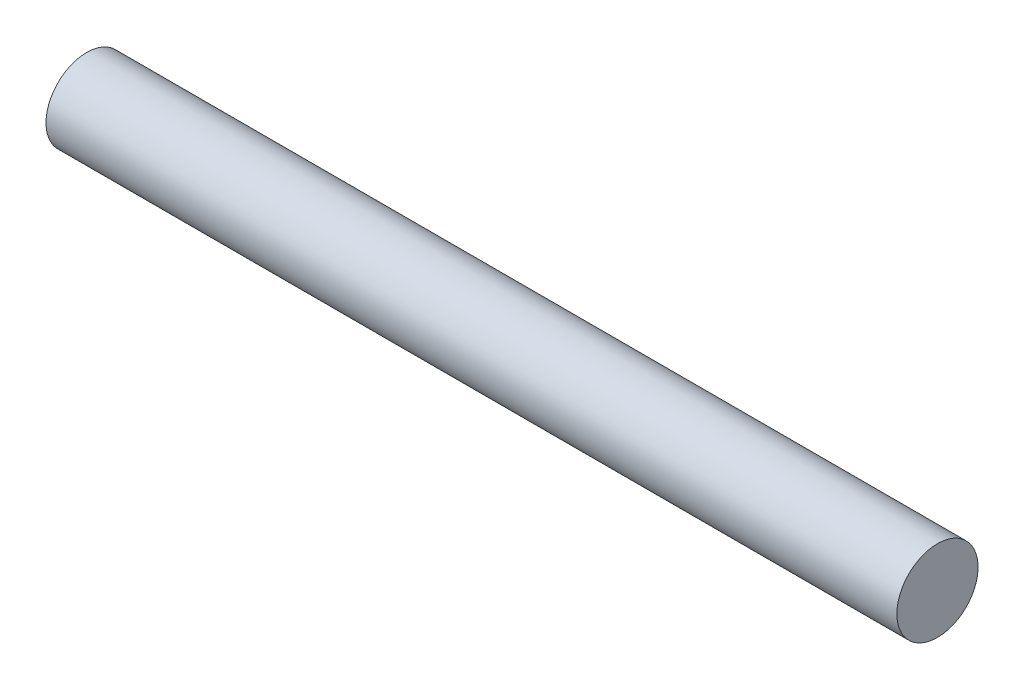
ISO-10303-21;
HEADER;
FILE_DESCRIPTION(('STEP AP214'),'2;1');
FILE_NAME('part.step','',(''),(''),'','','');
FILE_SCHEMA(('AUTOMOTIVE_DESIGN { 1 0 10303 214 1 1 1 1 }'));
ENDSEC;
DATA;
#1=APPLICATION_CONTEXT('core data for automotive mechanical design processes');
#2=APPLICATION_PROTOCOL_DEFINITION('international standard','automotive_design',2000,#1);
#3=PRODUCT_CONTEXT('',#1,'mechanical');
#4=PRODUCT('Part','Part','',(#3));
#5=PRODUCT_RELATED_PRODUCT_CATEGORY('part','',(#4));
#6=PRODUCT_DEFINITION_FORMATION('','',#4);
#7=PRODUCT_DEFINITION_CONTEXT('part definition',#1,'design');
#8=PRODUCT_DEFINITION('design','',#6,#7);
#9=PRODUCT_DEFINITION_SHAPE('','',#8);
#10=(LENGTH_UNIT() NAMED_UNIT(*) SI_UNIT(.MILLI.,.METRE.));
#11=(NAMED_UNIT(*) PLANE_ANGLE_UNIT() SI_UNIT($,.RADIAN.));
#12=(NAMED_UNIT(*) SI_UNIT($,.STERADIAN.) SOLID_ANGLE_UNIT());
#13=UNCERTAINTY_MEASURE_WITH_UNIT(LENGTH_MEASURE(1.E-05),#10,'distance_accuracy_value','');
#14=(GEOMETRIC_REPRESENTATION_CONTEXT(3) GLOBAL_UNCERTAINTY_ASSIGNED_CONTEXT((#13)) GLOBAL_UNIT_ASSIGNED_CONTEXT((#10,
#11,#12)) REPRESENTATION_CONTEXT('',''));
#15=CARTESIAN_POINT('',(0.,0.,0.));
#16=DIRECTION('',(0.,0.,1.));
#17=DIRECTION('',(1.,0.,0.));
#18=AXIS2_PLACEMENT_3D('',#15,#16,#17);
#19=CARTESIAN_POINT('',(52.36,0.,0.));
#20=DIRECTION('',(-1.,0.,0.));
#21=DIRECTION('',(0.,0.,1.));
#22=AXIS2_PLACEMENT_3D('',#19,#20,#21);
#23=PLANE('',#22);
#24=CARTESIAN_POINT('',(52.36,0.,0.));
#25=DIRECTION('',(-1.,0.,0.));
#26=DIRECTION('',(0.,0.,1.));
#27=AXIS2_PLACEMENT_3D('',#24,#25,#26);
#28=CIRCLE('',#27,2.5);
#29=CARTESIAN_POINT('',(52.36,0.,2.5));
#30=VERTEX_POINT('',#29);
#31=EDGE_CURVE('E10',#30,#30,#28,.T.);
#32=ORIENTED_EDGE('',*,*,#31,.F.);
#33=EDGE_LOOP('',(#32));
#34=FACE_BOUND('',#33,.T.);
#35=ADVANCED_FACE('F37',(#34),#23,.F.);
#36=CARTESIAN_POINT('',(0.,0.,0.));
#37=DIRECTION('',(-1.,0.,0.));
#38=DIRECTION('',(0.,0.,1.));
#39=AXIS2_PLACEMENT_3D('',#36,#37,#38);
#40=CYLINDRICAL_SURFACE('',#39,2.5);
#41=CARTESIAN_POINT('',(0.,0.,0.));
#42=DIRECTION('',(-1.,0.,0.));
#43=DIRECTION('',(0.,0.,1.));
#44=AXIS2_PLACEMENT_3D('',#41,#42,#43);
#45=CIRCLE('',#44,2.5);
#46=CARTESIAN_POINT('',(0.,0.,2.5));
#47=VERTEX_POINT('',#46);
#48=EDGE_CURVE('E44',#47,#47,#45,.T.);
#49=ORIENTED_EDGE('',*,*,#48,.F.);
#50=EDGE_LOOP('',(#49));
#51=FACE_BOUND('',#50,.T.);
#52=ORIENTED_EDGE('',*,*,#31,.T.);
#53=EDGE_LOOP('',(#52));
#54=FACE_BOUND('',#53,.T.);
#55=ADVANCED_FACE('F53',(#51,#54),#40,.T.);
#56=CARTESIAN_POINT('',(0.,2.5,0.));
#57=DIRECTION('',(1.,0.,0.));
#58=DIRECTION('',(0.,0.,-1.));
#59=AXIS2_PLACEMENT_3D('',#56,#57,#58);
#60=PLANE('',#59);
#61=ORIENTED_EDGE('',*,*,#48,.T.);
#62=EDGE_LOOP('',(#61));
#63=FACE_BOUND('',#62,.T.);
#64=ADVANCED_FACE('F51',(#63),#60,.F.);
#65=CLOSED_SHELL('',(#35,#55,#64));
#66=MANIFOLD_SOLID_BREP('B2',#65);
#67=ADVANCED_BREP_SHAPE_REPRESENTATION('',(#18,#66),#14);
#68=SHAPE_DEFINITION_REPRESENTATION(#9,#67);
ENDSEC;
END-ISO-10303-21;
